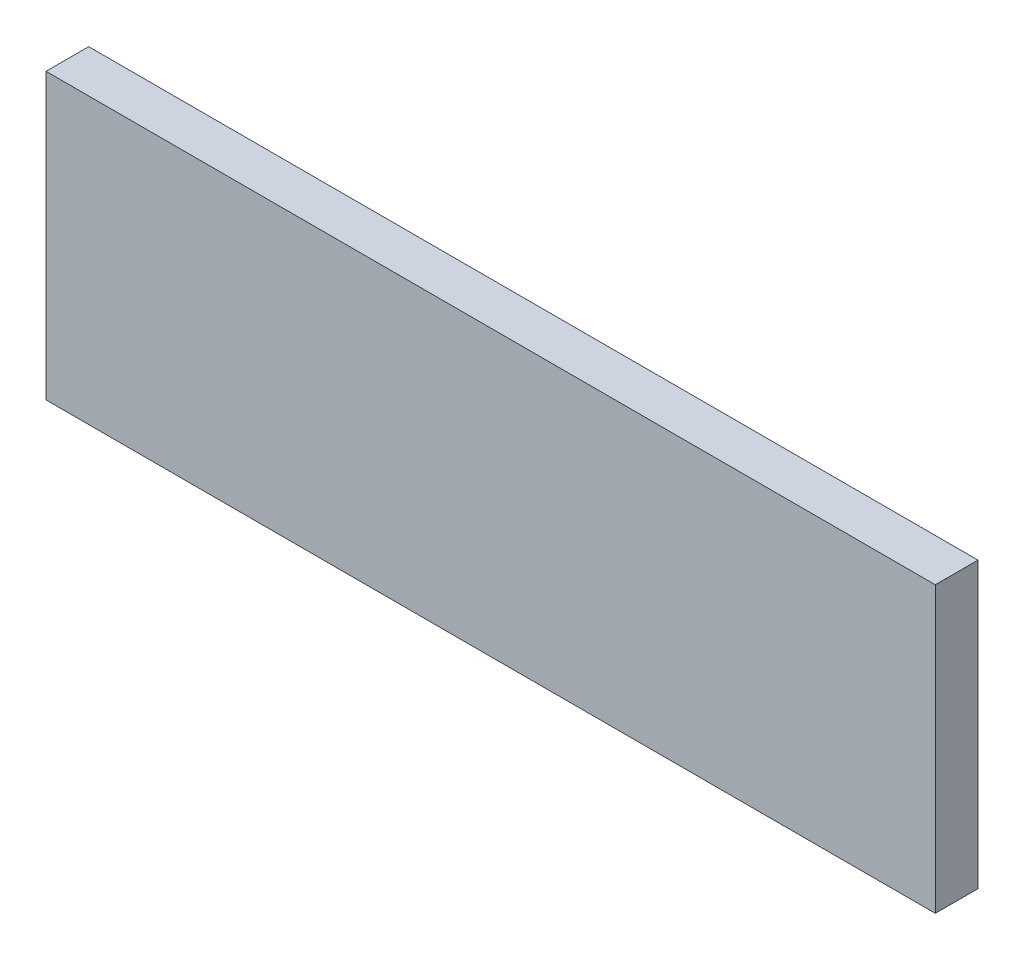
ISO-10303-21;
HEADER;
FILE_DESCRIPTION(('STEP AP214'),'2;1');
FILE_NAME('part.step','',(''),(''),'','','');
FILE_SCHEMA(('AUTOMOTIVE_DESIGN { 1 0 10303 214 1 1 1 1 }'));
ENDSEC;
DATA;
#1=APPLICATION_CONTEXT('core data for automotive mechanical design processes');
#2=APPLICATION_PROTOCOL_DEFINITION('international standard','automotive_design',2000,#1);
#3=PRODUCT_CONTEXT('',#1,'mechanical');
#4=PRODUCT('Part','Part','',(#3));
#5=PRODUCT_RELATED_PRODUCT_CATEGORY('part','',(#4));
#6=PRODUCT_DEFINITION_FORMATION('','',#4);
#7=PRODUCT_DEFINITION_CONTEXT('part definition',#1,'design');
#8=PRODUCT_DEFINITION('design','',#6,#7);
#9=PRODUCT_DEFINITION_SHAPE('','',#8);
#10=(LENGTH_UNIT() NAMED_UNIT(*) SI_UNIT(.MILLI.,.METRE.));
#11=(NAMED_UNIT(*) PLANE_ANGLE_UNIT() SI_UNIT($,.RADIAN.));
#12=(NAMED_UNIT(*) SI_UNIT($,.STERADIAN.) SOLID_ANGLE_UNIT());
#13=UNCERTAINTY_MEASURE_WITH_UNIT(LENGTH_MEASURE(1.E-05),#10,'distance_accuracy_value','');
#14=(GEOMETRIC_REPRESENTATION_CONTEXT(3) GLOBAL_UNCERTAINTY_ASSIGNED_CONTEXT((#13)) GLOBAL_UNIT_ASSIGNED_CONTEXT((#10,
#11,#12)) REPRESENTATION_CONTEXT('',''));
#15=CARTESIAN_POINT('',(0.,0.,0.));
#16=DIRECTION('',(0.,0.,1.));
#17=DIRECTION('',(1.,0.,0.));
#18=AXIS2_PLACEMENT_3D('',#15,#16,#17);
#19=CARTESIAN_POINT('',(-23.6842105263158,5.95141700404858,1.2));
#20=DIRECTION('',(1.,0.,0.));
#21=DIRECTION('',(0.,0.,-1.));
#22=AXIS2_PLACEMENT_3D('',#19,#20,#21);
#23=PLANE('',#22);
#24=DIRECTION('',(0.,-1.,0.));
#25=VECTOR('',#24,1.);
#26=CARTESIAN_POINT('',(-23.6842105263158,5.95141700404858,0.));
#27=LINE('',#26,#25);
#28=CARTESIAN_POINT('',(-23.6842105263158,5.95141700404858,0.));
#29=VERTEX_POINT('',#28);
#30=CARTESIAN_POINT('',(-23.6842105263158,-2.04858299595142,0.));
#31=VERTEX_POINT('',#30);
#32=EDGE_CURVE('E96',#29,#31,#27,.T.);
#33=ORIENTED_EDGE('',*,*,#32,.T.);
#34=DIRECTION('',(0.,0.,-1.));
#35=VECTOR('',#34,1.);
#36=CARTESIAN_POINT('',(-23.6842105263158,-2.04858299595142,1.2));
#37=LINE('',#36,#35);
#38=CARTESIAN_POINT('',(-23.6842105263158,-2.04858299595142,1.2));
#39=VERTEX_POINT('',#38);
#40=EDGE_CURVE('E11',#39,#31,#37,.T.);
#41=ORIENTED_EDGE('',*,*,#40,.F.);
#42=DIRECTION('',(0.,-1.,0.));
#43=VECTOR('',#42,1.);
#44=CARTESIAN_POINT('',(-23.6842105263158,5.95141700404858,1.2));
#45=LINE('',#44,#43);
#46=CARTESIAN_POINT('',(-23.6842105263158,5.95141700404858,1.2));
#47=VERTEX_POINT('',#46);
#48=EDGE_CURVE('E84',#47,#39,#45,.T.);
#49=ORIENTED_EDGE('',*,*,#48,.F.);
#50=DIRECTION('',(0.,0.,-1.));
#51=VECTOR('',#50,1.);
#52=CARTESIAN_POINT('',(-23.6842105263158,5.95141700404858,1.2));
#53=LINE('',#52,#51);
#54=EDGE_CURVE('E92',#47,#29,#53,.T.);
#55=ORIENTED_EDGE('',*,*,#54,.T.);
#56=EDGE_LOOP('',(#33,#41,#49,#55));
#57=FACE_BOUND('',#56,.T.);
#58=ADVANCED_FACE('F33',(#57),#23,.F.);
#59=CARTESIAN_POINT('',(-23.6842105263158,-2.04858299595142,1.2));
#60=DIRECTION('',(0.,1.,0.));
#61=DIRECTION('',(0.,0.,1.));
#62=AXIS2_PLACEMENT_3D('',#59,#60,#61);
#63=PLANE('',#62);
#64=DIRECTION('',(1.,0.,0.));
#65=VECTOR('',#64,1.);
#66=CARTESIAN_POINT('',(-23.6842105263158,-2.04858299595142,0.));
#67=LINE('',#66,#65);
#68=CARTESIAN_POINT('',(1.31578947368421,-2.04858299595142,0.));
#69=VERTEX_POINT('',#68);
#70=EDGE_CURVE('E88',#31,#69,#67,.T.);
#71=ORIENTED_EDGE('',*,*,#70,.T.);
#72=DIRECTION('',(0.,0.,-1.));
#73=VECTOR('',#72,1.);
#74=CARTESIAN_POINT('',(1.31578947368421,-2.04858299595142,1.2));
#75=LINE('',#74,#73);
#76=CARTESIAN_POINT('',(1.31578947368421,-2.04858299595142,1.2));
#77=VERTEX_POINT('',#76);
#78=EDGE_CURVE('E41',#77,#69,#75,.T.);
#79=ORIENTED_EDGE('',*,*,#78,.F.);
#80=DIRECTION('',(1.,0.,0.));
#81=VECTOR('',#80,1.);
#82=CARTESIAN_POINT('',(-23.6842105263158,-2.04858299595142,1.2));
#83=LINE('',#82,#81);
#84=EDGE_CURVE('E79',#39,#77,#83,.T.);
#85=ORIENTED_EDGE('',*,*,#84,.F.);
#86=ORIENTED_EDGE('',*,*,#40,.T.);
#87=EDGE_LOOP('',(#71,#79,#85,#86));
#88=FACE_BOUND('',#87,.T.);
#89=ADVANCED_FACE('F87',(#88),#63,.F.);
#90=CARTESIAN_POINT('',(1.31578947368421,5.95141700404858,1.2));
#91=DIRECTION('',(-1.,0.,0.));
#92=DIRECTION('',(0.,0.,1.));
#93=AXIS2_PLACEMENT_3D('',#90,#91,#92);
#94=PLANE('',#93);
#95=DIRECTION('',(0.,1.,0.));
#96=VECTOR('',#95,1.);
#97=CARTESIAN_POINT('',(1.31578947368421,5.95141700404858,0.));
#98=LINE('',#97,#96);
#99=CARTESIAN_POINT('',(1.31578947368421,5.95141700404858,0.));
#100=VERTEX_POINT('',#99);
#101=EDGE_CURVE('E66',#69,#100,#98,.T.);
#102=ORIENTED_EDGE('',*,*,#101,.T.);
#103=DIRECTION('',(0.,0.,-1.));
#104=VECTOR('',#103,1.);
#105=CARTESIAN_POINT('',(1.31578947368421,5.95141700404858,1.2));
#106=LINE('',#105,#104);
#107=CARTESIAN_POINT('',(1.31578947368421,5.95141700404858,1.2));
#108=VERTEX_POINT('',#107);
#109=EDGE_CURVE('E89',#108,#100,#106,.T.);
#110=ORIENTED_EDGE('',*,*,#109,.F.);
#111=DIRECTION('',(0.,1.,0.));
#112=VECTOR('',#111,1.);
#113=CARTESIAN_POINT('',(1.31578947368421,5.95141700404858,1.2));
#114=LINE('',#113,#112);
#115=EDGE_CURVE('E82',#77,#108,#114,.T.);
#116=ORIENTED_EDGE('',*,*,#115,.F.);
#117=ORIENTED_EDGE('',*,*,#78,.T.);
#118=EDGE_LOOP('',(#102,#110,#116,#117));
#119=FACE_BOUND('',#118,.T.);
#120=ADVANCED_FACE('F90',(#119),#94,.F.);
#121=CARTESIAN_POINT('',(-23.6842105263158,5.95141700404858,1.2));
#122=DIRECTION('',(0.,-1.,0.));
#123=DIRECTION('',(0.,0.,-1.));
#124=AXIS2_PLACEMENT_3D('',#121,#122,#123);
#125=PLANE('',#124);
#126=DIRECTION('',(-1.,0.,0.));
#127=VECTOR('',#126,1.);
#128=CARTESIAN_POINT('',(-23.6842105263158,5.95141700404858,0.));
#129=LINE('',#128,#127);
#130=EDGE_CURVE('E72',#100,#29,#129,.T.);
#131=ORIENTED_EDGE('',*,*,#130,.T.);
#132=ORIENTED_EDGE('',*,*,#54,.F.);
#133=DIRECTION('',(-1.,0.,0.));
#134=VECTOR('',#133,1.);
#135=CARTESIAN_POINT('',(-23.6842105263158,5.95141700404858,1.2));
#136=LINE('',#135,#134);
#137=EDGE_CURVE('E49',#108,#47,#136,.T.);
#138=ORIENTED_EDGE('',*,*,#137,.F.);
#139=ORIENTED_EDGE('',*,*,#109,.T.);
#140=EDGE_LOOP('',(#131,#132,#138,#139));
#141=FACE_BOUND('',#140,.T.);
#142=ADVANCED_FACE('F103',(#141),#125,.F.);
#143=CARTESIAN_POINT('',(0.,0.,1.2));
#144=DIRECTION('',(0.,0.,1.));
#145=DIRECTION('',(1.,0.,0.));
#146=AXIS2_PLACEMENT_3D('',#143,#144,#145);
#147=PLANE('',#146);
#148=ORIENTED_EDGE('',*,*,#48,.T.);
#149=ORIENTED_EDGE('',*,*,#84,.T.);
#150=ORIENTED_EDGE('',*,*,#115,.T.);
#151=ORIENTED_EDGE('',*,*,#137,.T.);
#152=EDGE_LOOP('',(#148,#149,#150,#151));
#153=FACE_BOUND('',#152,.T.);
#154=ADVANCED_FACE('F80',(#153),#147,.T.);
#155=CARTESIAN_POINT('',(0.,0.,0.));
#156=DIRECTION('',(0.,0.,1.));
#157=DIRECTION('',(1.,0.,0.));
#158=AXIS2_PLACEMENT_3D('',#155,#156,#157);
#159=PLANE('',#158);
#160=ORIENTED_EDGE('',*,*,#32,.F.);
#161=ORIENTED_EDGE('',*,*,#130,.F.);
#162=ORIENTED_EDGE('',*,*,#101,.F.);
#163=ORIENTED_EDGE('',*,*,#70,.F.);
#164=EDGE_LOOP('',(#160,#161,#162,#163));
#165=FACE_BOUND('',#164,.T.);
#166=ADVANCED_FACE('F106',(#165),#159,.F.);
#167=CLOSED_SHELL('',(#58,#89,#120,#142,#154,#166));
#168=MANIFOLD_SOLID_BREP('B2',#167);
#169=ADVANCED_BREP_SHAPE_REPRESENTATION('',(#18,#168),#14);
#170=SHAPE_DEFINITION_REPRESENTATION(#9,#169);
ENDSEC;
END-ISO-10303-21;
